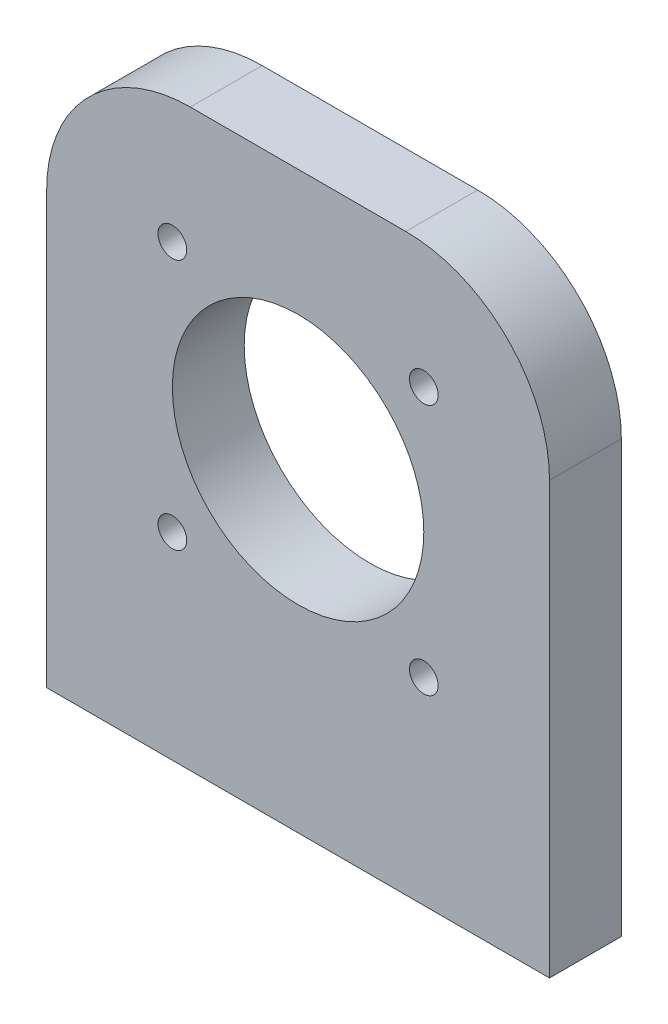
ISO-10303-21;
HEADER;
FILE_DESCRIPTION(('STEP AP214'),'2;1');
FILE_NAME('part.step','',(''),(''),'','','');
FILE_SCHEMA(('AUTOMOTIVE_DESIGN { 1 0 10303 214 1 1 1 1 }'));
ENDSEC;
DATA;
#1=APPLICATION_CONTEXT('core data for automotive mechanical design processes');
#2=APPLICATION_PROTOCOL_DEFINITION('international standard','automotive_design',2000,#1);
#3=PRODUCT_CONTEXT('',#1,'mechanical');
#4=PRODUCT('Part','Part','',(#3));
#5=PRODUCT_RELATED_PRODUCT_CATEGORY('part','',(#4));
#6=PRODUCT_DEFINITION_FORMATION('','',#4);
#7=PRODUCT_DEFINITION_CONTEXT('part definition',#1,'design');
#8=PRODUCT_DEFINITION('design','',#6,#7);
#9=PRODUCT_DEFINITION_SHAPE('','',#8);
#10=(LENGTH_UNIT() NAMED_UNIT(*) SI_UNIT(.MILLI.,.METRE.));
#11=(NAMED_UNIT(*) PLANE_ANGLE_UNIT() SI_UNIT($,.RADIAN.));
#12=(NAMED_UNIT(*) SI_UNIT($,.STERADIAN.) SOLID_ANGLE_UNIT());
#13=UNCERTAINTY_MEASURE_WITH_UNIT(LENGTH_MEASURE(1.E-05),#10,'distance_accuracy_value','');
#14=(GEOMETRIC_REPRESENTATION_CONTEXT(3) GLOBAL_UNCERTAINTY_ASSIGNED_CONTEXT((#13)) GLOBAL_UNIT_ASSIGNED_CONTEXT((#10,
#11,#12)) REPRESENTATION_CONTEXT('',''));
#15=CARTESIAN_POINT('',(0.,0.,0.));
#16=DIRECTION('',(0.,0.,1.));
#17=DIRECTION('',(1.,0.,0.));
#18=AXIS2_PLACEMENT_3D('',#15,#16,#17);
#19=CARTESIAN_POINT('',(0.,0.,10.));
#20=DIRECTION('',(0.,0.,1.));
#21=DIRECTION('',(1.,0.,0.));
#22=AXIS2_PLACEMENT_3D('',#19,#20,#21);
#23=PLANE('',#22);
#24=CARTESIAN_POINT('',(17.5,-52.5,10.));
#25=DIRECTION('',(0.,0.,1.));
#26=DIRECTION('',(1.,0.,0.));
#27=AXIS2_PLACEMENT_3D('',#24,#25,#26);
#28=CIRCLE('',#27,2.00000000000001);
#29=CARTESIAN_POINT('',(19.5,-52.5,10.));
#30=VERTEX_POINT('',#29);
#31=EDGE_CURVE('E179',#30,#30,#28,.T.);
#32=ORIENTED_EDGE('',*,*,#31,.F.);
#33=EDGE_LOOP('',(#32));
#34=FACE_BOUND('',#33,.T.);
#35=CARTESIAN_POINT('',(52.5,-52.5,10.));
#36=DIRECTION('',(0.,0.,1.));
#37=DIRECTION('',(1.,0.,0.));
#38=AXIS2_PLACEMENT_3D('',#35,#36,#37);
#39=CIRCLE('',#38,2.);
#40=CARTESIAN_POINT('',(54.5,-52.5,10.));
#41=VERTEX_POINT('',#40);
#42=EDGE_CURVE('E185',#41,#41,#39,.T.);
#43=ORIENTED_EDGE('',*,*,#42,.F.);
#44=EDGE_LOOP('',(#43));
#45=FACE_BOUND('',#44,.T.);
#46=CARTESIAN_POINT('',(52.5,-17.5,10.));
#47=DIRECTION('',(0.,0.,1.));
#48=DIRECTION('',(1.,0.,0.));
#49=AXIS2_PLACEMENT_3D('',#46,#47,#48);
#50=CIRCLE('',#49,2.);
#51=CARTESIAN_POINT('',(54.5,-17.5,10.));
#52=VERTEX_POINT('',#51);
#53=EDGE_CURVE('E191',#52,#52,#50,.T.);
#54=ORIENTED_EDGE('',*,*,#53,.F.);
#55=EDGE_LOOP('',(#54));
#56=FACE_BOUND('',#55,.T.);
#57=CARTESIAN_POINT('',(17.5,-17.5,10.));
#58=DIRECTION('',(0.,0.,1.));
#59=DIRECTION('',(1.,0.,0.));
#60=AXIS2_PLACEMENT_3D('',#57,#58,#59);
#61=CIRCLE('',#60,2.00000000000001);
#62=CARTESIAN_POINT('',(19.5,-17.5,10.));
#63=VERTEX_POINT('',#62);
#64=EDGE_CURVE('E173',#63,#63,#61,.T.);
#65=ORIENTED_EDGE('',*,*,#64,.F.);
#66=EDGE_LOOP('',(#65));
#67=FACE_BOUND('',#66,.T.);
#68=DIRECTION('',(0.,-1.,0.));
#69=VECTOR('',#68,1.);
#70=CARTESIAN_POINT('',(70.,0.,10.));
#71=LINE('',#70,#69);
#72=CARTESIAN_POINT('',(70.,-20.,10.));
#73=VERTEX_POINT('',#72);
#74=CARTESIAN_POINT('',(70.,-80.,10.));
#75=VERTEX_POINT('',#74);
#76=EDGE_CURVE('E123',#73,#75,#71,.T.);
#77=ORIENTED_EDGE('',*,*,#76,.F.);
#78=CARTESIAN_POINT('',(50.,-20.,10.));
#79=DIRECTION('',(0.,0.,1.));
#80=DIRECTION('',(1.,0.,0.));
#81=AXIS2_PLACEMENT_3D('',#78,#79,#80);
#82=CIRCLE('',#81,20.);
#83=CARTESIAN_POINT('',(50.,0.,10.));
#84=VERTEX_POINT('',#83);
#85=EDGE_CURVE('E61',#73,#84,#82,.T.);
#86=ORIENTED_EDGE('',*,*,#85,.T.);
#87=DIRECTION('',(1.,0.,0.));
#88=VECTOR('',#87,1.);
#89=CARTESIAN_POINT('',(0.,0.,10.));
#90=LINE('',#89,#88);
#91=CARTESIAN_POINT('',(20.,0.,10.));
#92=VERTEX_POINT('',#91);
#93=EDGE_CURVE('E133',#92,#84,#90,.T.);
#94=ORIENTED_EDGE('',*,*,#93,.F.);
#95=CARTESIAN_POINT('',(20.,-20.,10.));
#96=DIRECTION('',(0.,0.,1.));
#97=DIRECTION('',(1.,0.,0.));
#98=AXIS2_PLACEMENT_3D('',#95,#96,#97);
#99=CIRCLE('',#98,20.);
#100=CARTESIAN_POINT('',(0.,-20.,10.));
#101=VERTEX_POINT('',#100);
#102=EDGE_CURVE('E68',#92,#101,#99,.T.);
#103=ORIENTED_EDGE('',*,*,#102,.T.);
#104=DIRECTION('',(0.,-1.,0.));
#105=VECTOR('',#104,1.);
#106=CARTESIAN_POINT('',(0.,0.,10.));
#107=LINE('',#106,#105);
#108=CARTESIAN_POINT('',(0.,-80.,10.));
#109=VERTEX_POINT('',#108);
#110=EDGE_CURVE('E106',#101,#109,#107,.T.);
#111=ORIENTED_EDGE('',*,*,#110,.T.);
#112=DIRECTION('',(1.,0.,0.));
#113=VECTOR('',#112,1.);
#114=CARTESIAN_POINT('',(0.,-80.,10.));
#115=LINE('',#114,#113);
#116=EDGE_CURVE('E109',#109,#75,#115,.T.);
#117=ORIENTED_EDGE('',*,*,#116,.T.);
#118=EDGE_LOOP('',(#77,#86,#94,#103,#111,#117));
#119=FACE_BOUND('',#118,.T.);
#120=CARTESIAN_POINT('',(35.,-35.,10.));
#121=DIRECTION('',(0.,0.,1.));
#122=DIRECTION('',(1.,0.,0.));
#123=AXIS2_PLACEMENT_3D('',#120,#121,#122);
#124=CIRCLE('',#123,17.5);
#125=CARTESIAN_POINT('',(52.5,-35.,10.));
#126=VERTEX_POINT('',#125);
#127=EDGE_CURVE('E164',#126,#126,#124,.T.);
#128=ORIENTED_EDGE('',*,*,#127,.F.);
#129=EDGE_LOOP('',(#128));
#130=FACE_BOUND('',#129,.T.);
#131=ADVANCED_FACE('F53',(#34,#45,#56,#67,#119,#130),#23,.T.);
#132=CARTESIAN_POINT('',(0.,0.,0.));
#133=DIRECTION('',(0.,0.,1.));
#134=DIRECTION('',(1.,0.,0.));
#135=AXIS2_PLACEMENT_3D('',#132,#133,#134);
#136=PLANE('',#135);
#137=CARTESIAN_POINT('',(17.5,-52.5,0.));
#138=DIRECTION('',(0.,0.,1.));
#139=DIRECTION('',(1.,0.,0.));
#140=AXIS2_PLACEMENT_3D('',#137,#138,#139);
#141=CIRCLE('',#140,2.00000000000001);
#142=CARTESIAN_POINT('',(19.5,-52.5,0.));
#143=VERTEX_POINT('',#142);
#144=EDGE_CURVE('E182',#143,#143,#141,.T.);
#145=ORIENTED_EDGE('',*,*,#144,.T.);
#146=EDGE_LOOP('',(#145));
#147=FACE_BOUND('',#146,.T.);
#148=CARTESIAN_POINT('',(52.5,-52.5,0.));
#149=DIRECTION('',(0.,0.,1.));
#150=DIRECTION('',(1.,0.,0.));
#151=AXIS2_PLACEMENT_3D('',#148,#149,#150);
#152=CIRCLE('',#151,2.);
#153=CARTESIAN_POINT('',(54.5,-52.5,0.));
#154=VERTEX_POINT('',#153);
#155=EDGE_CURVE('E188',#154,#154,#152,.T.);
#156=ORIENTED_EDGE('',*,*,#155,.T.);
#157=EDGE_LOOP('',(#156));
#158=FACE_BOUND('',#157,.T.);
#159=CARTESIAN_POINT('',(52.5,-17.5,0.));
#160=DIRECTION('',(0.,0.,1.));
#161=DIRECTION('',(1.,0.,0.));
#162=AXIS2_PLACEMENT_3D('',#159,#160,#161);
#163=CIRCLE('',#162,2.);
#164=CARTESIAN_POINT('',(54.5,-17.5,0.));
#165=VERTEX_POINT('',#164);
#166=EDGE_CURVE('E176',#165,#165,#163,.T.);
#167=ORIENTED_EDGE('',*,*,#166,.T.);
#168=EDGE_LOOP('',(#167));
#169=FACE_BOUND('',#168,.T.);
#170=CARTESIAN_POINT('',(17.5,-17.5,0.));
#171=DIRECTION('',(0.,0.,1.));
#172=DIRECTION('',(1.,0.,0.));
#173=AXIS2_PLACEMENT_3D('',#170,#171,#172);
#174=CIRCLE('',#173,2.00000000000001);
#175=CARTESIAN_POINT('',(19.5,-17.5,0.));
#176=VERTEX_POINT('',#175);
#177=EDGE_CURVE('E170',#176,#176,#174,.T.);
#178=ORIENTED_EDGE('',*,*,#177,.T.);
#179=EDGE_LOOP('',(#178));
#180=FACE_BOUND('',#179,.T.);
#181=DIRECTION('',(1.,0.,0.));
#182=VECTOR('',#181,1.);
#183=CARTESIAN_POINT('',(0.,0.,0.));
#184=LINE('',#183,#182);
#185=CARTESIAN_POINT('',(20.,0.,0.));
#186=VERTEX_POINT('',#185);
#187=CARTESIAN_POINT('',(50.,0.,0.));
#188=VERTEX_POINT('',#187);
#189=EDGE_CURVE('E114',#186,#188,#184,.T.);
#190=ORIENTED_EDGE('',*,*,#189,.T.);
#191=CARTESIAN_POINT('',(50.,-20.,0.));
#192=DIRECTION('',(0.,0.,1.));
#193=DIRECTION('',(1.,0.,0.));
#194=AXIS2_PLACEMENT_3D('',#191,#192,#193);
#195=CIRCLE('',#194,20.);
#196=CARTESIAN_POINT('',(70.,-20.,0.));
#197=VERTEX_POINT('',#196);
#198=EDGE_CURVE('E141',#188,#197,#195,.F.);
#199=ORIENTED_EDGE('',*,*,#198,.T.);
#200=DIRECTION('',(0.,-1.,0.));
#201=VECTOR('',#200,1.);
#202=CARTESIAN_POINT('',(70.,0.,0.));
#203=LINE('',#202,#201);
#204=CARTESIAN_POINT('',(70.,-80.,0.));
#205=VERTEX_POINT('',#204);
#206=EDGE_CURVE('E158',#197,#205,#203,.T.);
#207=ORIENTED_EDGE('',*,*,#206,.T.);
#208=DIRECTION('',(1.,0.,0.));
#209=VECTOR('',#208,1.);
#210=CARTESIAN_POINT('',(0.,-80.,0.));
#211=LINE('',#210,#209);
#212=CARTESIAN_POINT('',(0.,-80.,0.));
#213=VERTEX_POINT('',#212);
#214=EDGE_CURVE('E160',#213,#205,#211,.T.);
#215=ORIENTED_EDGE('',*,*,#214,.F.);
#216=DIRECTION('',(0.,-1.,0.));
#217=VECTOR('',#216,1.);
#218=CARTESIAN_POINT('',(0.,0.,0.));
#219=LINE('',#218,#217);
#220=CARTESIAN_POINT('',(0.,-20.,0.));
#221=VERTEX_POINT('',#220);
#222=EDGE_CURVE('E127',#221,#213,#219,.T.);
#223=ORIENTED_EDGE('',*,*,#222,.F.);
#224=CARTESIAN_POINT('',(20.,-20.,0.));
#225=DIRECTION('',(0.,0.,1.));
#226=DIRECTION('',(1.,0.,0.));
#227=AXIS2_PLACEMENT_3D('',#224,#225,#226);
#228=CIRCLE('',#227,20.);
#229=EDGE_CURVE('E139',#221,#186,#228,.F.);
#230=ORIENTED_EDGE('',*,*,#229,.T.);
#231=EDGE_LOOP('',(#190,#199,#207,#215,#223,#230));
#232=FACE_BOUND('',#231,.T.);
#233=CARTESIAN_POINT('',(35.,-35.,0.));
#234=DIRECTION('',(0.,0.,1.));
#235=DIRECTION('',(1.,0.,0.));
#236=AXIS2_PLACEMENT_3D('',#233,#234,#235);
#237=CIRCLE('',#236,17.5);
#238=CARTESIAN_POINT('',(52.5,-35.,0.));
#239=VERTEX_POINT('',#238);
#240=EDGE_CURVE('E167',#239,#239,#237,.T.);
#241=ORIENTED_EDGE('',*,*,#240,.T.);
#242=EDGE_LOOP('',(#241));
#243=FACE_BOUND('',#242,.T.);
#244=ADVANCED_FACE('F156',(#147,#158,#169,#180,#232,#243),#136,.F.);
#245=CARTESIAN_POINT('',(0.,0.,10.));
#246=DIRECTION('',(1.,0.,0.));
#247=DIRECTION('',(0.,1.,0.));
#248=AXIS2_PLACEMENT_3D('',#245,#246,#247);
#249=PLANE('',#248);
#250=ORIENTED_EDGE('',*,*,#110,.F.);
#251=DIRECTION('',(0.,0.,-1.));
#252=VECTOR('',#251,1.);
#253=CARTESIAN_POINT('',(0.,-20.,0.));
#254=LINE('',#253,#252);
#255=EDGE_CURVE('E12',#101,#221,#254,.T.);
#256=ORIENTED_EDGE('',*,*,#255,.T.);
#257=ORIENTED_EDGE('',*,*,#222,.T.);
#258=DIRECTION('',(0.,0.,-1.));
#259=VECTOR('',#258,1.);
#260=CARTESIAN_POINT('',(0.,-80.,10.));
#261=LINE('',#260,#259);
#262=EDGE_CURVE('E120',#109,#213,#261,.T.);
#263=ORIENTED_EDGE('',*,*,#262,.F.);
#264=EDGE_LOOP('',(#250,#256,#257,#263));
#265=FACE_BOUND('',#264,.T.);
#266=ADVANCED_FACE('F125',(#265),#249,.F.);
#267=CARTESIAN_POINT('',(0.,-80.,10.));
#268=DIRECTION('',(0.,1.,0.));
#269=DIRECTION('',(-1.,0.,0.));
#270=AXIS2_PLACEMENT_3D('',#267,#268,#269);
#271=PLANE('',#270);
#272=ORIENTED_EDGE('',*,*,#214,.T.);
#273=DIRECTION('',(0.,0.,-1.));
#274=VECTOR('',#273,1.);
#275=CARTESIAN_POINT('',(70.,-80.,10.));
#276=LINE('',#275,#274);
#277=EDGE_CURVE('E122',#75,#205,#276,.T.);
#278=ORIENTED_EDGE('',*,*,#277,.F.);
#279=ORIENTED_EDGE('',*,*,#116,.F.);
#280=ORIENTED_EDGE('',*,*,#262,.T.);
#281=EDGE_LOOP('',(#272,#278,#279,#280));
#282=FACE_BOUND('',#281,.T.);
#283=ADVANCED_FACE('F119',(#282),#271,.F.);
#284=CARTESIAN_POINT('',(70.,0.,10.));
#285=DIRECTION('',(1.,0.,0.));
#286=DIRECTION('',(0.,1.,0.));
#287=AXIS2_PLACEMENT_3D('',#284,#285,#286);
#288=PLANE('',#287);
#289=ORIENTED_EDGE('',*,*,#206,.F.);
#290=DIRECTION('',(0.,0.,-1.));
#291=VECTOR('',#290,1.);
#292=CARTESIAN_POINT('',(70.,-20.,10.));
#293=LINE('',#292,#291);
#294=EDGE_CURVE('E76',#197,#73,#293,.F.);
#295=ORIENTED_EDGE('',*,*,#294,.T.);
#296=ORIENTED_EDGE('',*,*,#76,.T.);
#297=ORIENTED_EDGE('',*,*,#277,.T.);
#298=EDGE_LOOP('',(#289,#295,#296,#297));
#299=FACE_BOUND('',#298,.T.);
#300=ADVANCED_FACE('F159',(#299),#288,.T.);
#301=CARTESIAN_POINT('',(0.,0.,10.));
#302=DIRECTION('',(0.,1.,0.));
#303=DIRECTION('',(0.,0.,1.));
#304=AXIS2_PLACEMENT_3D('',#301,#302,#303);
#305=PLANE('',#304);
#306=ORIENTED_EDGE('',*,*,#93,.T.);
#307=DIRECTION('',(0.,0.,-1.));
#308=VECTOR('',#307,1.);
#309=CARTESIAN_POINT('',(50.,0.,10.));
#310=LINE('',#309,#308);
#311=EDGE_CURVE('E131',#84,#188,#310,.T.);
#312=ORIENTED_EDGE('',*,*,#311,.T.);
#313=ORIENTED_EDGE('',*,*,#189,.F.);
#314=DIRECTION('',(0.,0.,-1.));
#315=VECTOR('',#314,1.);
#316=CARTESIAN_POINT('',(20.,0.,10.));
#317=LINE('',#316,#315);
#318=EDGE_CURVE('E129',#186,#92,#317,.F.);
#319=ORIENTED_EDGE('',*,*,#318,.T.);
#320=EDGE_LOOP('',(#306,#312,#313,#319));
#321=FACE_BOUND('',#320,.T.);
#322=ADVANCED_FACE('F149',(#321),#305,.T.);
#323=CARTESIAN_POINT('',(35.,-35.,10.));
#324=DIRECTION('',(0.,0.,-1.));
#325=DIRECTION('',(-1.,0.,0.));
#326=AXIS2_PLACEMENT_3D('',#323,#324,#325);
#327=CYLINDRICAL_SURFACE('',#326,17.5);
#328=ORIENTED_EDGE('',*,*,#127,.T.);
#329=EDGE_LOOP('',(#328));
#330=FACE_BOUND('',#329,.T.);
#331=ORIENTED_EDGE('',*,*,#240,.F.);
#332=EDGE_LOOP('',(#331));
#333=FACE_BOUND('',#332,.T.);
#334=ADVANCED_FACE('F225',(#330,#333),#327,.F.);
#335=CARTESIAN_POINT('',(50.,-20.,10.));
#336=DIRECTION('',(0.,0.,-1.));
#337=DIRECTION('',(-1.,0.,0.));
#338=AXIS2_PLACEMENT_3D('',#335,#336,#337);
#339=CYLINDRICAL_SURFACE('',#338,20.);
#340=ORIENTED_EDGE('',*,*,#85,.F.);
#341=ORIENTED_EDGE('',*,*,#294,.F.);
#342=ORIENTED_EDGE('',*,*,#198,.F.);
#343=ORIENTED_EDGE('',*,*,#311,.F.);
#344=EDGE_LOOP('',(#340,#341,#342,#343));
#345=FACE_BOUND('',#344,.T.);
#346=ADVANCED_FACE('F154',(#345),#339,.T.);
#347=CARTESIAN_POINT('',(20.,-20.,10.));
#348=DIRECTION('',(0.,0.,1.));
#349=DIRECTION('',(1.,0.,0.));
#350=AXIS2_PLACEMENT_3D('',#347,#348,#349);
#351=CYLINDRICAL_SURFACE('',#350,20.);
#352=ORIENTED_EDGE('',*,*,#102,.F.);
#353=ORIENTED_EDGE('',*,*,#318,.F.);
#354=ORIENTED_EDGE('',*,*,#229,.F.);
#355=ORIENTED_EDGE('',*,*,#255,.F.);
#356=EDGE_LOOP('',(#352,#353,#354,#355));
#357=FACE_BOUND('',#356,.T.);
#358=ADVANCED_FACE('F55',(#357),#351,.T.);
#359=CARTESIAN_POINT('',(17.5,-17.5,0.));
#360=DIRECTION('',(0.,0.,1.));
#361=DIRECTION('',(1.,0.,0.));
#362=AXIS2_PLACEMENT_3D('',#359,#360,#361);
#363=CYLINDRICAL_SURFACE('',#362,2.00000000000001);
#364=ORIENTED_EDGE('',*,*,#177,.F.);
#365=EDGE_LOOP('',(#364));
#366=FACE_BOUND('',#365,.T.);
#367=ORIENTED_EDGE('',*,*,#64,.T.);
#368=EDGE_LOOP('',(#367));
#369=FACE_BOUND('',#368,.T.);
#370=ADVANCED_FACE('F203',(#366,#369),#363,.F.);
#371=CARTESIAN_POINT('',(52.5,-17.5,0.));
#372=DIRECTION('',(0.,0.,1.));
#373=DIRECTION('',(1.,0.,0.));
#374=AXIS2_PLACEMENT_3D('',#371,#372,#373);
#375=CYLINDRICAL_SURFACE('',#374,2.);
#376=ORIENTED_EDGE('',*,*,#166,.F.);
#377=EDGE_LOOP('',(#376));
#378=FACE_BOUND('',#377,.T.);
#379=ORIENTED_EDGE('',*,*,#53,.T.);
#380=EDGE_LOOP('',(#379));
#381=FACE_BOUND('',#380,.T.);
#382=ADVANCED_FACE('F199',(#378,#381),#375,.F.);
#383=CARTESIAN_POINT('',(52.5,-52.5,0.));
#384=DIRECTION('',(0.,0.,1.));
#385=DIRECTION('',(1.,0.,0.));
#386=AXIS2_PLACEMENT_3D('',#383,#384,#385);
#387=CYLINDRICAL_SURFACE('',#386,2.);
#388=ORIENTED_EDGE('',*,*,#155,.F.);
#389=EDGE_LOOP('',(#388));
#390=FACE_BOUND('',#389,.T.);
#391=ORIENTED_EDGE('',*,*,#42,.T.);
#392=EDGE_LOOP('',(#391));
#393=FACE_BOUND('',#392,.T.);
#394=ADVANCED_FACE('F202',(#390,#393),#387,.F.);
#395=CARTESIAN_POINT('',(17.5,-52.5,0.));
#396=DIRECTION('',(0.,0.,1.));
#397=DIRECTION('',(1.,0.,0.));
#398=AXIS2_PLACEMENT_3D('',#395,#396,#397);
#399=CYLINDRICAL_SURFACE('',#398,2.00000000000001);
#400=ORIENTED_EDGE('',*,*,#144,.F.);
#401=EDGE_LOOP('',(#400));
#402=FACE_BOUND('',#401,.T.);
#403=ORIENTED_EDGE('',*,*,#31,.T.);
#404=EDGE_LOOP('',(#403));
#405=FACE_BOUND('',#404,.T.);
#406=ADVANCED_FACE('F223',(#402,#405),#399,.F.);
#407=CLOSED_SHELL('',(#131,#244,#266,#283,#300,#322,#334,#346,#358,#370,#382,#394,#406));
#408=MANIFOLD_SOLID_BREP('B2',#407);
#409=ADVANCED_BREP_SHAPE_REPRESENTATION('',(#18,#408),#14);
#410=SHAPE_DEFINITION_REPRESENTATION(#9,#409);
ENDSEC;
END-ISO-10303-21;
